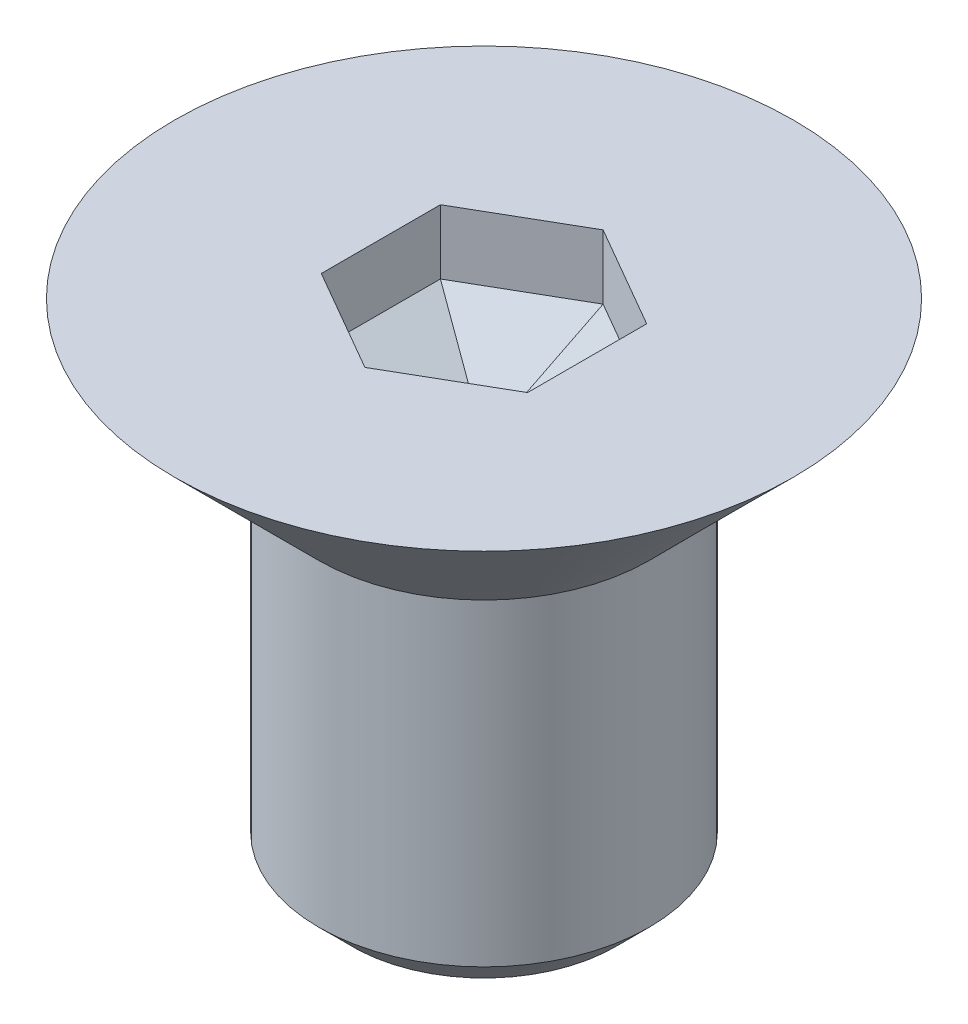
ISO-10303-21;
HEADER;
FILE_DESCRIPTION(('STEP AP214'),'2;1');
FILE_NAME('part.step','',(''),(''),'','','');
FILE_SCHEMA(('AUTOMOTIVE_DESIGN { 1 0 10303 214 1 1 1 1 }'));
ENDSEC;
DATA;
#1=APPLICATION_CONTEXT('core data for automotive mechanical design processes');
#2=APPLICATION_PROTOCOL_DEFINITION('international standard','automotive_design',2000,#1);
#3=PRODUCT_CONTEXT('',#1,'mechanical');
#4=PRODUCT('Part','Part','',(#3));
#5=PRODUCT_RELATED_PRODUCT_CATEGORY('part','',(#4));
#6=PRODUCT_DEFINITION_FORMATION('','',#4);
#7=PRODUCT_DEFINITION_CONTEXT('part definition',#1,'design');
#8=PRODUCT_DEFINITION('design','',#6,#7);
#9=PRODUCT_DEFINITION_SHAPE('','',#8);
#10=(LENGTH_UNIT() NAMED_UNIT(*) SI_UNIT(.MILLI.,.METRE.));
#11=(NAMED_UNIT(*) PLANE_ANGLE_UNIT() SI_UNIT($,.RADIAN.));
#12=(NAMED_UNIT(*) SI_UNIT($,.STERADIAN.) SOLID_ANGLE_UNIT());
#13=UNCERTAINTY_MEASURE_WITH_UNIT(LENGTH_MEASURE(1.E-05),#10,'distance_accuracy_value','');
#14=(GEOMETRIC_REPRESENTATION_CONTEXT(3) GLOBAL_UNCERTAINTY_ASSIGNED_CONTEXT((#13)) GLOBAL_UNIT_ASSIGNED_CONTEXT((#10,
#11,#12)) REPRESENTATION_CONTEXT('',''));
#15=CARTESIAN_POINT('',(0.,0.,0.));
#16=DIRECTION('',(0.,0.,1.));
#17=DIRECTION('',(1.,0.,0.));
#18=AXIS2_PLACEMENT_3D('',#15,#16,#17);
#19=CARTESIAN_POINT('',(0.,-2.48,0.));
#20=DIRECTION('',(0.,1.,0.));
#21=DIRECTION('',(0.,0.,1.));
#22=AXIS2_PLACEMENT_3D('',#19,#20,#21);
#23=CONICAL_SURFACE('',#22,1.27000000000003,0.785398163397443);
#24=CARTESIAN_POINT('',(0.,0.,0.));
#25=DIRECTION('',(0.,-1.,0.));
#26=DIRECTION('',(0.,0.,-1.));
#27=AXIS2_PLACEMENT_3D('',#24,#25,#26);
#28=CIRCLE('',#27,3.75);
#29=CARTESIAN_POINT('',(0.,0.,-3.75));
#30=VERTEX_POINT('',#29);
#31=EDGE_CURVE('E156',#30,#30,#28,.T.);
#32=ORIENTED_EDGE('',*,*,#31,.T.);
#33=EDGE_LOOP('',(#32));
#34=FACE_BOUND('',#33,.T.);
#35=CARTESIAN_POINT('',(0.,-1.75000000000002,0.));
#36=DIRECTION('',(0.,1.,0.));
#37=DIRECTION('',(0.,0.,1.));
#38=AXIS2_PLACEMENT_3D('',#35,#36,#37);
#39=CIRCLE('',#38,2.);
#40=CARTESIAN_POINT('',(0.,-1.75000000000002,2.));
#41=VERTEX_POINT('',#40);
#42=EDGE_CURVE('E151',#41,#41,#39,.T.);
#43=ORIENTED_EDGE('',*,*,#42,.T.);
#44=EDGE_LOOP('',(#43));
#45=FACE_BOUND('',#44,.T.);
#46=ADVANCED_FACE('F43',(#34,#45),#23,.T.);
#47=CARTESIAN_POINT('',(0.,0.,0.));
#48=DIRECTION('',(0.,1.,0.));
#49=DIRECTION('',(0.,0.,1.));
#50=AXIS2_PLACEMENT_3D('',#47,#48,#49);
#51=PLANE('',#50);
#52=DIRECTION('',(0.,0.,-1.));
#53=VECTOR('',#52,1.);
#54=CARTESIAN_POINT('',(1.25,0.,0.721687836487033));
#55=LINE('',#54,#53);
#56=CARTESIAN_POINT('',(1.25,0.,0.721687836487033));
#57=VERTEX_POINT('',#56);
#58=CARTESIAN_POINT('',(1.25,0.,-0.721687836487032));
#59=VERTEX_POINT('',#58);
#60=EDGE_CURVE('E132',#57,#59,#55,.T.);
#61=ORIENTED_EDGE('',*,*,#60,.F.);
#62=DIRECTION('',(0.866025403784439,0.,-0.5));
#63=VECTOR('',#62,1.);
#64=CARTESIAN_POINT('',(0.,0.,1.44337567297407));
#65=LINE('',#64,#63);
#66=CARTESIAN_POINT('',(0.,0.,1.44337567297407));
#67=VERTEX_POINT('',#66);
#68=EDGE_CURVE('E148',#67,#57,#65,.T.);
#69=ORIENTED_EDGE('',*,*,#68,.F.);
#70=DIRECTION('',(0.866025403784438,0.,0.5));
#71=VECTOR('',#70,1.);
#72=CARTESIAN_POINT('',(-1.25,0.,0.721687836487033));
#73=LINE('',#72,#71);
#74=CARTESIAN_POINT('',(-1.25,0.,0.721687836487033));
#75=VERTEX_POINT('',#74);
#76=EDGE_CURVE('E137',#75,#67,#73,.T.);
#77=ORIENTED_EDGE('',*,*,#76,.F.);
#78=DIRECTION('',(0.,0.,1.));
#79=VECTOR('',#78,1.);
#80=CARTESIAN_POINT('',(-1.25,0.,-0.721687836487032));
#81=LINE('',#80,#79);
#82=CARTESIAN_POINT('',(-1.25,0.,-0.721687836487032));
#83=VERTEX_POINT('',#82);
#84=EDGE_CURVE('E136',#83,#75,#81,.T.);
#85=ORIENTED_EDGE('',*,*,#84,.F.);
#86=DIRECTION('',(-0.866025403784439,0.,0.5));
#87=VECTOR('',#86,1.);
#88=CARTESIAN_POINT('',(0.,0.,-1.44337567297406));
#89=LINE('',#88,#87);
#90=CARTESIAN_POINT('',(0.,0.,-1.44337567297406));
#91=VERTEX_POINT('',#90);
#92=EDGE_CURVE('E118',#91,#83,#89,.T.);
#93=ORIENTED_EDGE('',*,*,#92,.F.);
#94=DIRECTION('',(-0.866025403784439,0.,-0.5));
#95=VECTOR('',#94,1.);
#96=CARTESIAN_POINT('',(1.25,0.,-0.721687836487032));
#97=LINE('',#96,#95);
#98=EDGE_CURVE('E129',#59,#91,#97,.T.);
#99=ORIENTED_EDGE('',*,*,#98,.F.);
#100=EDGE_LOOP('',(#61,#69,#77,#85,#93,#99));
#101=FACE_BOUND('',#100,.T.);
#102=ORIENTED_EDGE('',*,*,#31,.F.);
#103=EDGE_LOOP('',(#102));
#104=FACE_BOUND('',#103,.T.);
#105=ADVANCED_FACE('F133',(#101,#104),#51,.T.);
#106=CARTESIAN_POINT('',(0.,-6.,0.));
#107=DIRECTION('',(0.,1.,0.));
#108=DIRECTION('',(0.,0.,1.));
#109=AXIS2_PLACEMENT_3D('',#106,#107,#108);
#110=CYLINDRICAL_SURFACE('',#109,2.);
#111=CARTESIAN_POINT('',(0.,-5.6,0.));
#112=DIRECTION('',(0.,-1.,0.));
#113=DIRECTION('',(0.,0.,-1.));
#114=AXIS2_PLACEMENT_3D('',#111,#112,#113);
#115=CIRCLE('',#114,2.);
#116=CARTESIAN_POINT('',(0.,-5.6,-2.));
#117=VERTEX_POINT('',#116);
#118=EDGE_CURVE('E11',#117,#117,#115,.F.);
#119=ORIENTED_EDGE('',*,*,#118,.T.);
#120=EDGE_LOOP('',(#119));
#121=FACE_BOUND('',#120,.T.);
#122=ORIENTED_EDGE('',*,*,#42,.F.);
#123=EDGE_LOOP('',(#122));
#124=FACE_BOUND('',#123,.T.);
#125=ADVANCED_FACE('F221',(#121,#124),#110,.T.);
#126=CARTESIAN_POINT('',(0.,-6.,0.));
#127=DIRECTION('',(0.,-1.,0.));
#128=DIRECTION('',(0.,0.,-1.));
#129=AXIS2_PLACEMENT_3D('',#126,#127,#128);
#130=PLANE('',#129);
#131=CARTESIAN_POINT('',(0.,-6.,0.));
#132=DIRECTION('',(0.,-1.,0.));
#133=DIRECTION('',(0.,0.,-1.));
#134=AXIS2_PLACEMENT_3D('',#131,#132,#133);
#135=CIRCLE('',#134,1.6);
#136=CARTESIAN_POINT('',(0.,-6.,-1.6));
#137=VERTEX_POINT('',#136);
#138=EDGE_CURVE('E51',#137,#137,#135,.T.);
#139=ORIENTED_EDGE('',*,*,#138,.T.);
#140=EDGE_LOOP('',(#139));
#141=FACE_BOUND('',#140,.T.);
#142=ADVANCED_FACE('F204',(#141),#130,.T.);
#143=CARTESIAN_POINT('',(1.25,-1.5,0.721687836487033));
#144=DIRECTION('',(1.,0.,0.));
#145=DIRECTION('',(0.,0.,-1.));
#146=AXIS2_PLACEMENT_3D('',#143,#144,#145);
#147=PLANE('',#146);
#148=DIRECTION('',(0.,1.,0.));
#149=VECTOR('',#148,1.);
#150=CARTESIAN_POINT('',(1.25,-1.5,-0.721687836487032));
#151=LINE('',#150,#149);
#152=CARTESIAN_POINT('',(1.25,-0.779538904899138,-0.721687836487032));
#153=VERTEX_POINT('',#152);
#154=EDGE_CURVE('E121',#153,#59,#151,.T.);
#155=ORIENTED_EDGE('',*,*,#154,.F.);
#156=DIRECTION('',(0.,0.,1.));
#157=VECTOR('',#156,1.);
#158=CARTESIAN_POINT('',(1.25,-0.779538904899138,0.721687836487033));
#159=LINE('',#158,#157);
#160=CARTESIAN_POINT('',(1.25,-0.779538904899138,0.721687836487033));
#161=VERTEX_POINT('',#160);
#162=EDGE_CURVE('E61',#153,#161,#159,.T.);
#163=ORIENTED_EDGE('',*,*,#162,.T.);
#164=DIRECTION('',(0.,1.,0.));
#165=VECTOR('',#164,1.);
#166=CARTESIAN_POINT('',(1.25,-1.5,0.721687836487033));
#167=LINE('',#166,#165);
#168=EDGE_CURVE('E150',#161,#57,#167,.T.);
#169=ORIENTED_EDGE('',*,*,#168,.T.);
#170=ORIENTED_EDGE('',*,*,#60,.T.);
#171=EDGE_LOOP('',(#155,#163,#169,#170));
#172=FACE_BOUND('',#171,.T.);
#173=ADVANCED_FACE('F278',(#172),#147,.F.);
#174=CARTESIAN_POINT('',(0.,-1.5,1.44337567297407));
#175=DIRECTION('',(0.5,0.,0.866025403784439));
#176=DIRECTION('',(0.866025403784439,0.,-0.5));
#177=AXIS2_PLACEMENT_3D('',#174,#175,#176);
#178=PLANE('',#177);
#179=ORIENTED_EDGE('',*,*,#168,.F.);
#180=DIRECTION('',(-0.866025403784439,0.,0.5));
#181=VECTOR('',#180,1.);
#182=CARTESIAN_POINT('',(0.,-0.779538904899138,1.44337567297407));
#183=LINE('',#182,#181);
#184=CARTESIAN_POINT('',(0.,-0.779538904899138,1.44337567297407));
#185=VERTEX_POINT('',#184);
#186=EDGE_CURVE('E185',#161,#185,#183,.T.);
#187=ORIENTED_EDGE('',*,*,#186,.T.);
#188=DIRECTION('',(0.,1.,0.));
#189=VECTOR('',#188,1.);
#190=CARTESIAN_POINT('',(0.,-1.5,1.44337567297407));
#191=LINE('',#190,#189);
#192=EDGE_CURVE('E152',#185,#67,#191,.T.);
#193=ORIENTED_EDGE('',*,*,#192,.T.);
#194=ORIENTED_EDGE('',*,*,#68,.T.);
#195=EDGE_LOOP('',(#179,#187,#193,#194));
#196=FACE_BOUND('',#195,.T.);
#197=ADVANCED_FACE('F262',(#196),#178,.F.);
#198=CARTESIAN_POINT('',(-1.25,-1.5,0.721687836487033));
#199=DIRECTION('',(-0.5,0.,0.866025403784439));
#200=DIRECTION('',(0.866025403784439,0.,0.5));
#201=AXIS2_PLACEMENT_3D('',#198,#199,#200);
#202=PLANE('',#201);
#203=ORIENTED_EDGE('',*,*,#192,.F.);
#204=DIRECTION('',(-0.866025403784439,0.,-0.5));
#205=VECTOR('',#204,1.);
#206=CARTESIAN_POINT('',(-1.25,-0.779538904899138,0.721687836487033));
#207=LINE('',#206,#205);
#208=CARTESIAN_POINT('',(-1.25,-0.779538904899138,0.721687836487033));
#209=VERTEX_POINT('',#208);
#210=EDGE_CURVE('E176',#185,#209,#207,.T.);
#211=ORIENTED_EDGE('',*,*,#210,.T.);
#212=DIRECTION('',(0.,1.,0.));
#213=VECTOR('',#212,1.);
#214=CARTESIAN_POINT('',(-1.25,-1.5,0.721687836487033));
#215=LINE('',#214,#213);
#216=EDGE_CURVE('E153',#209,#75,#215,.T.);
#217=ORIENTED_EDGE('',*,*,#216,.T.);
#218=ORIENTED_EDGE('',*,*,#76,.T.);
#219=EDGE_LOOP('',(#203,#211,#217,#218));
#220=FACE_BOUND('',#219,.T.);
#221=ADVANCED_FACE('F265',(#220),#202,.F.);
#222=CARTESIAN_POINT('',(-1.25,-1.5,-0.721687836487032));
#223=DIRECTION('',(-1.,0.,0.));
#224=DIRECTION('',(0.,0.,1.));
#225=AXIS2_PLACEMENT_3D('',#222,#223,#224);
#226=PLANE('',#225);
#227=ORIENTED_EDGE('',*,*,#216,.F.);
#228=DIRECTION('',(0.,0.,-1.));
#229=VECTOR('',#228,1.);
#230=CARTESIAN_POINT('',(-1.25,-0.779538904899138,-0.721687836487032));
#231=LINE('',#230,#229);
#232=CARTESIAN_POINT('',(-1.25,-0.779538904899139,-0.721687836487032));
#233=VERTEX_POINT('',#232);
#234=EDGE_CURVE('E177',#209,#233,#231,.T.);
#235=ORIENTED_EDGE('',*,*,#234,.T.);
#236=DIRECTION('',(0.,1.,0.));
#237=VECTOR('',#236,1.);
#238=CARTESIAN_POINT('',(-1.25,-1.5,-0.721687836487032));
#239=LINE('',#238,#237);
#240=EDGE_CURVE('E124',#233,#83,#239,.T.);
#241=ORIENTED_EDGE('',*,*,#240,.T.);
#242=ORIENTED_EDGE('',*,*,#84,.T.);
#243=EDGE_LOOP('',(#227,#235,#241,#242));
#244=FACE_BOUND('',#243,.T.);
#245=ADVANCED_FACE('F274',(#244),#226,.F.);
#246=CARTESIAN_POINT('',(0.,-1.5,-1.44337567297406));
#247=DIRECTION('',(-0.5,0.,-0.866025403784439));
#248=DIRECTION('',(-0.866025403784439,0.,0.5));
#249=AXIS2_PLACEMENT_3D('',#246,#247,#248);
#250=PLANE('',#249);
#251=ORIENTED_EDGE('',*,*,#240,.F.);
#252=DIRECTION('',(0.866025403784439,0.,-0.5));
#253=VECTOR('',#252,1.);
#254=CARTESIAN_POINT('',(0.,-0.779538904899139,-1.44337567297406));
#255=LINE('',#254,#253);
#256=CARTESIAN_POINT('',(0.,-0.779538904899138,-1.44337567297406));
#257=VERTEX_POINT('',#256);
#258=EDGE_CURVE('E125',#233,#257,#255,.T.);
#259=ORIENTED_EDGE('',*,*,#258,.T.);
#260=DIRECTION('',(0.,1.,0.));
#261=VECTOR('',#260,1.);
#262=CARTESIAN_POINT('',(0.,-1.5,-1.44337567297406));
#263=LINE('',#262,#261);
#264=EDGE_CURVE('E112',#257,#91,#263,.T.);
#265=ORIENTED_EDGE('',*,*,#264,.T.);
#266=ORIENTED_EDGE('',*,*,#92,.T.);
#267=EDGE_LOOP('',(#251,#259,#265,#266));
#268=FACE_BOUND('',#267,.T.);
#269=ADVANCED_FACE('F120',(#268),#250,.F.);
#270=CARTESIAN_POINT('',(1.25,-1.5,-0.721687836487032));
#271=DIRECTION('',(0.5,0.,-0.866025403784438));
#272=DIRECTION('',(-0.866025403784439,0.,-0.5));
#273=AXIS2_PLACEMENT_3D('',#270,#271,#272);
#274=PLANE('',#273);
#275=ORIENTED_EDGE('',*,*,#264,.F.);
#276=DIRECTION('',(0.866025403784439,0.,0.5));
#277=VECTOR('',#276,1.);
#278=CARTESIAN_POINT('',(1.25,-0.779538904899138,-0.721687836487032));
#279=LINE('',#278,#277);
#280=EDGE_CURVE('E59',#257,#153,#279,.T.);
#281=ORIENTED_EDGE('',*,*,#280,.T.);
#282=ORIENTED_EDGE('',*,*,#154,.T.);
#283=ORIENTED_EDGE('',*,*,#98,.T.);
#284=EDGE_LOOP('',(#275,#281,#282,#283));
#285=FACE_BOUND('',#284,.T.);
#286=ADVANCED_FACE('F127',(#285),#274,.F.);
#287=CARTESIAN_POINT('',(0.,-1.5,0.));
#288=DIRECTION('',(0.,1.,0.));
#289=DIRECTION('',(0.,0.,1.));
#290=AXIS2_PLACEMENT_3D('',#287,#288,#289);
#291=PLANE('',#290);
#292=DIRECTION('',(0.,0.,1.));
#293=VECTOR('',#292,1.);
#294=CARTESIAN_POINT('',(-0.00212477840857766,-1.5,0.));
#295=LINE('',#294,#293);
#296=CARTESIAN_POINT('',(-0.00212477840857769,-1.5,-0.00122674138616097));
#297=VERTEX_POINT('',#296);
#298=CARTESIAN_POINT('',(-0.00212477840857766,-1.5,0.00122674138616103));
#299=VERTEX_POINT('',#298);
#300=EDGE_CURVE('E171',#297,#299,#295,.T.);
#301=ORIENTED_EDGE('',*,*,#300,.T.);
#302=DIRECTION('',(0.866025403784439,0.,0.5));
#303=VECTOR('',#302,1.);
#304=CARTESIAN_POINT('',(-0.00106238920428899,-1.5,0.00184011207924121));
#305=LINE('',#304,#303);
#306=CARTESIAN_POINT('',(0.,-1.5,0.00245348277232215));
#307=VERTEX_POINT('',#306);
#308=EDGE_CURVE('E173',#299,#307,#305,.T.);
#309=ORIENTED_EDGE('',*,*,#308,.T.);
#310=DIRECTION('',(0.866025403784439,0.,-0.5));
#311=VECTOR('',#310,1.);
#312=CARTESIAN_POINT('',(0.00106238920428951,-1.5,0.0018401120792421));
#313=LINE('',#312,#311);
#314=CARTESIAN_POINT('',(0.00212477840857745,-1.5,0.00122674138616225));
#315=VERTEX_POINT('',#314);
#316=EDGE_CURVE('E170',#307,#315,#313,.T.);
#317=ORIENTED_EDGE('',*,*,#316,.T.);
#318=DIRECTION('',(0.,0.,-1.));
#319=VECTOR('',#318,1.);
#320=CARTESIAN_POINT('',(0.00212477840857745,-1.5,0.));
#321=LINE('',#320,#319);
#322=CARTESIAN_POINT('',(0.00212477840857745,-1.5,-0.00122674138616128));
#323=VERTEX_POINT('',#322);
#324=EDGE_CURVE('E164',#315,#323,#321,.T.);
#325=ORIENTED_EDGE('',*,*,#324,.T.);
#326=DIRECTION('',(-0.866025403784439,0.,-0.5));
#327=VECTOR('',#326,1.);
#328=CARTESIAN_POINT('',(0.00106238920428905,-1.5,-0.0018401120792413));
#329=LINE('',#328,#327);
#330=CARTESIAN_POINT('',(0.,-1.5,-0.00245348277232164));
#331=VERTEX_POINT('',#330);
#332=EDGE_CURVE('E163',#323,#331,#329,.T.);
#333=ORIENTED_EDGE('',*,*,#332,.T.);
#334=DIRECTION('',(-0.866025403784439,0.,0.5));
#335=VECTOR('',#334,1.);
#336=CARTESIAN_POINT('',(-0.00106238920428897,-1.5,-0.00184011207924116));
#337=LINE('',#336,#335);
#338=EDGE_CURVE('E169',#331,#297,#337,.T.);
#339=ORIENTED_EDGE('',*,*,#338,.T.);
#340=EDGE_LOOP('',(#301,#309,#317,#325,#333,#339));
#341=FACE_BOUND('',#340,.T.);
#342=ADVANCED_FACE('F244',(#341),#291,.T.);
#343=CARTESIAN_POINT('',(0.0010623892042891,-1.5,-0.0018401120792414));
#344=DIRECTION('',(0.249999999999998,-0.866025403784441,-0.433012701892215));
#345=DIRECTION('',(-0.866025403784439,0.,-0.5));
#346=AXIS2_PLACEMENT_3D('',#343,#344,#345);
#347=PLANE('',#346);
#348=DIRECTION('',(0.774596669241486,0.447213595499953,-0.447213595499958));
#349=VECTOR('',#348,1.);
#350=CARTESIAN_POINT('',(0.00169982272686165,-1.50024534827723,-0.000981393108929095));
#351=LINE('',#350,#349);
#352=EDGE_CURVE('E196',#153,#323,#351,.F.);
#353=ORIENTED_EDGE('',*,*,#352,.F.);
#354=ORIENTED_EDGE('',*,*,#280,.F.);
#355=DIRECTION('',(0.,-0.447213595499953,0.894427190999918));
#356=VECTOR('',#355,1.);
#357=CARTESIAN_POINT('',(0.,-1.50024534827723,-0.00196278621785722));
#358=LINE('',#357,#356);
#359=EDGE_CURVE('E198',#331,#257,#358,.F.);
#360=ORIENTED_EDGE('',*,*,#359,.F.);
#361=ORIENTED_EDGE('',*,*,#332,.F.);
#362=EDGE_LOOP('',(#353,#354,#360,#361));
#363=FACE_BOUND('',#362,.T.);
#364=ADVANCED_FACE('F245',(#363),#347,.F.);
#365=CARTESIAN_POINT('',(-0.00106238920428894,-1.5,-0.00184011207924112));
#366=DIRECTION('',(-0.249999999999997,-0.866025403784442,-0.433012701892215));
#367=DIRECTION('',(-0.866025403784439,0.,0.5));
#368=AXIS2_PLACEMENT_3D('',#365,#366,#367);
#369=PLANE('',#368);
#370=ORIENTED_EDGE('',*,*,#359,.T.);
#371=ORIENTED_EDGE('',*,*,#258,.F.);
#372=DIRECTION('',(0.774596669241486,-0.447213595499953,0.447213595499959));
#373=VECTOR('',#372,1.);
#374=CARTESIAN_POINT('',(-0.00169982272686204,-1.50024534827723,-0.000981393108928694));
#375=LINE('',#374,#373);
#376=EDGE_CURVE('E192',#297,#233,#375,.F.);
#377=ORIENTED_EDGE('',*,*,#376,.F.);
#378=ORIENTED_EDGE('',*,*,#338,.F.);
#379=EDGE_LOOP('',(#370,#371,#377,#378));
#380=FACE_BOUND('',#379,.T.);
#381=ADVANCED_FACE('F237',(#380),#369,.F.);
#382=CARTESIAN_POINT('',(0.00212477840857745,-1.5,0.));
#383=DIRECTION('',(0.499999999999995,-0.866025403784442,0.));
#384=DIRECTION('',(0.,0.,-1.));
#385=AXIS2_PLACEMENT_3D('',#382,#383,#384);
#386=PLANE('',#385);
#387=ORIENTED_EDGE('',*,*,#352,.T.);
#388=ORIENTED_EDGE('',*,*,#324,.F.);
#389=DIRECTION('',(0.774596669241486,0.447213595499953,0.447213595499959));
#390=VECTOR('',#389,1.);
#391=CARTESIAN_POINT('',(0.00169982272686226,-1.50024534827723,0.000981393108930321));
#392=LINE('',#391,#390);
#393=EDGE_CURVE('E188',#161,#315,#392,.F.);
#394=ORIENTED_EDGE('',*,*,#393,.F.);
#395=ORIENTED_EDGE('',*,*,#162,.F.);
#396=EDGE_LOOP('',(#387,#388,#394,#395));
#397=FACE_BOUND('',#396,.T.);
#398=ADVANCED_FACE('F232',(#397),#386,.F.);
#399=CARTESIAN_POINT('',(-0.00212477840857766,-1.5,0.));
#400=DIRECTION('',(-0.499999999999995,-0.866025403784442,0.));
#401=DIRECTION('',(0.,0.,1.));
#402=AXIS2_PLACEMENT_3D('',#399,#400,#401);
#403=PLANE('',#402);
#404=ORIENTED_EDGE('',*,*,#376,.T.);
#405=ORIENTED_EDGE('',*,*,#234,.F.);
#406=DIRECTION('',(0.774596669241486,-0.447213595499953,-0.447213595499959));
#407=VECTOR('',#406,1.);
#408=CARTESIAN_POINT('',(-0.00169982272686219,-1.50024534827723,0.000981393108928906));
#409=LINE('',#408,#407);
#410=EDGE_CURVE('E189',#299,#209,#409,.F.);
#411=ORIENTED_EDGE('',*,*,#410,.F.);
#412=ORIENTED_EDGE('',*,*,#300,.F.);
#413=EDGE_LOOP('',(#404,#405,#411,#412));
#414=FACE_BOUND('',#413,.T.);
#415=ADVANCED_FACE('F233',(#414),#403,.F.);
#416=CARTESIAN_POINT('',(0.00106238920428948,-1.5,0.00184011207924205));
#417=DIRECTION('',(0.249999999999997,-0.866025403784442,0.433012701892215));
#418=DIRECTION('',(0.866025403784439,0.,-0.5));
#419=AXIS2_PLACEMENT_3D('',#416,#417,#418);
#420=PLANE('',#419);
#421=ORIENTED_EDGE('',*,*,#393,.T.);
#422=ORIENTED_EDGE('',*,*,#316,.F.);
#423=DIRECTION('',(0.,0.447213595499953,0.894427190999918));
#424=VECTOR('',#423,1.);
#425=CARTESIAN_POINT('',(0.,-1.50024534827723,0.0019627862178574));
#426=LINE('',#425,#424);
#427=EDGE_CURVE('E187',#185,#307,#426,.F.);
#428=ORIENTED_EDGE('',*,*,#427,.F.);
#429=ORIENTED_EDGE('',*,*,#186,.F.);
#430=EDGE_LOOP('',(#421,#422,#428,#429));
#431=FACE_BOUND('',#430,.T.);
#432=ADVANCED_FACE('F212',(#431),#420,.F.);
#433=CARTESIAN_POINT('',(-0.00106238920428899,-1.5,0.00184011207924121));
#434=DIRECTION('',(-0.249999999999997,-0.866025403784442,0.433012701892215));
#435=DIRECTION('',(0.866025403784439,0.,0.5));
#436=AXIS2_PLACEMENT_3D('',#433,#434,#435);
#437=PLANE('',#436);
#438=ORIENTED_EDGE('',*,*,#410,.T.);
#439=ORIENTED_EDGE('',*,*,#210,.F.);
#440=ORIENTED_EDGE('',*,*,#427,.T.);
#441=ORIENTED_EDGE('',*,*,#308,.F.);
#442=EDGE_LOOP('',(#438,#439,#440,#441));
#443=FACE_BOUND('',#442,.T.);
#444=ADVANCED_FACE('F210',(#443),#437,.F.);
#445=CARTESIAN_POINT('',(0.,-6.,0.));
#446=DIRECTION('',(0.,1.,0.));
#447=DIRECTION('',(0.,0.,1.));
#448=AXIS2_PLACEMENT_3D('',#445,#446,#447);
#449=CONICAL_SURFACE('',#448,1.6,0.785398163397449);
#450=ORIENTED_EDGE('',*,*,#118,.F.);
#451=EDGE_LOOP('',(#450));
#452=FACE_BOUND('',#451,.T.);
#453=ORIENTED_EDGE('',*,*,#138,.F.);
#454=EDGE_LOOP('',(#453));
#455=FACE_BOUND('',#454,.T.);
#456=ADVANCED_FACE('F44',(#452,#455),#449,.T.);
#457=CLOSED_SHELL('',(#46,#105,#125,#142,#173,#197,#221,#245,#269,#286,#342,#364,#381,#398,#415,
#432,#444,#456));
#458=MANIFOLD_SOLID_BREP('B2',#457);
#459=ADVANCED_BREP_SHAPE_REPRESENTATION('',(#18,#458),#14);
#460=SHAPE_DEFINITION_REPRESENTATION(#9,#459);
ENDSEC;
END-ISO-10303-21;
